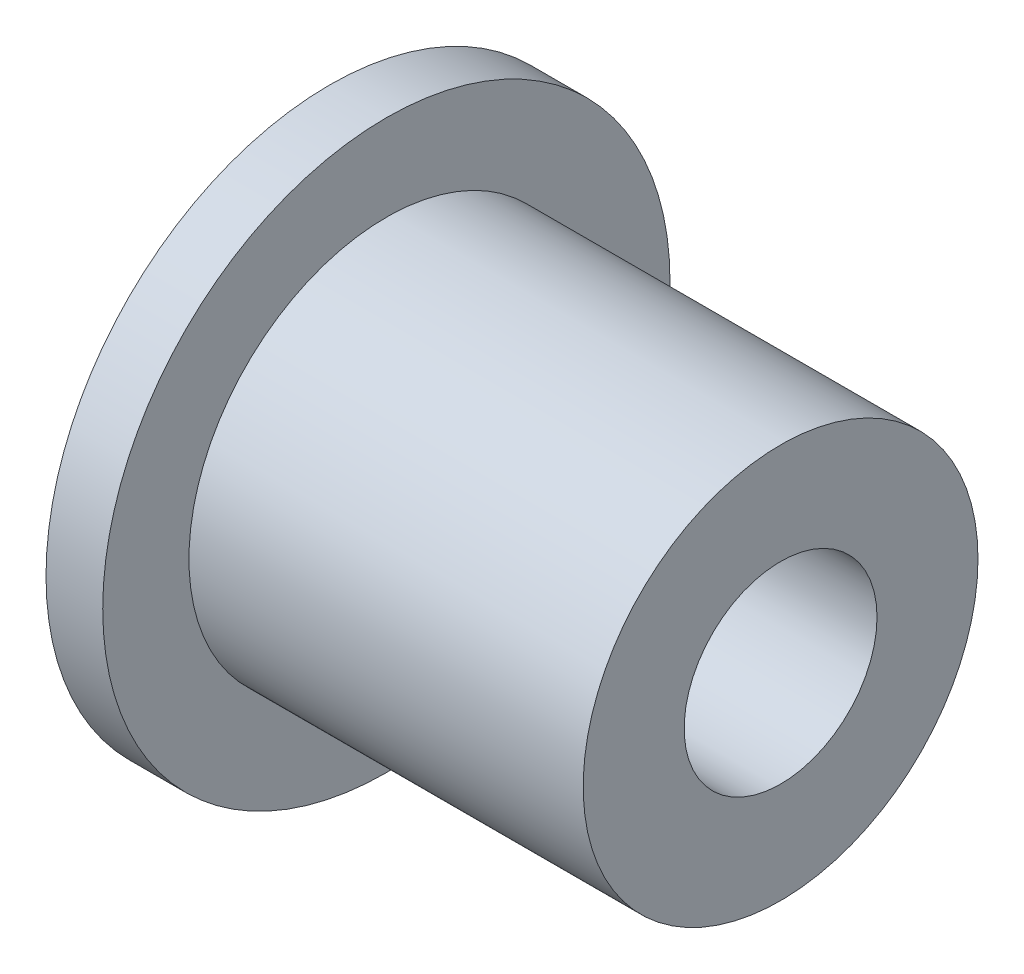
ISO-10303-21;
HEADER;
FILE_DESCRIPTION(('STEP AP214'),'2;1');
FILE_NAME('part.step','',(''),(''),'','','');
FILE_SCHEMA(('AUTOMOTIVE_DESIGN { 1 0 10303 214 1 1 1 1 }'));
ENDSEC;
DATA;
#1=APPLICATION_CONTEXT('core data for automotive mechanical design processes');
#2=APPLICATION_PROTOCOL_DEFINITION('international standard','automotive_design',2000,#1);
#3=PRODUCT_CONTEXT('',#1,'mechanical');
#4=PRODUCT('Part','Part','',(#3));
#5=PRODUCT_RELATED_PRODUCT_CATEGORY('part','',(#4));
#6=PRODUCT_DEFINITION_FORMATION('','',#4);
#7=PRODUCT_DEFINITION_CONTEXT('part definition',#1,'design');
#8=PRODUCT_DEFINITION('design','',#6,#7);
#9=PRODUCT_DEFINITION_SHAPE('','',#8);
#10=(LENGTH_UNIT() NAMED_UNIT(*) SI_UNIT(.MILLI.,.METRE.));
#11=(NAMED_UNIT(*) PLANE_ANGLE_UNIT() SI_UNIT($,.RADIAN.));
#12=(NAMED_UNIT(*) SI_UNIT($,.STERADIAN.) SOLID_ANGLE_UNIT());
#13=UNCERTAINTY_MEASURE_WITH_UNIT(LENGTH_MEASURE(1.E-05),#10,'distance_accuracy_value','');
#14=(GEOMETRIC_REPRESENTATION_CONTEXT(3) GLOBAL_UNCERTAINTY_ASSIGNED_CONTEXT((#13)) GLOBAL_UNIT_ASSIGNED_CONTEXT((#10,
#11,#12)) REPRESENTATION_CONTEXT('',''));
#15=CARTESIAN_POINT('',(0.,0.,0.));
#16=DIRECTION('',(0.,0.,1.));
#17=DIRECTION('',(1.,0.,0.));
#18=AXIS2_PLACEMENT_3D('',#15,#16,#17);
#19=CARTESIAN_POINT('',(-41.65,80.6,0.));
#20=DIRECTION('',(1.,0.,0.));
#21=DIRECTION('',(0.,0.,1.));
#22=AXIS2_PLACEMENT_3D('',#19,#20,#21);
#23=PLANE('',#22);
#24=CARTESIAN_POINT('',(-41.65,80.6,0.));
#25=DIRECTION('',(1.,0.,0.));
#26=DIRECTION('',(0.,0.,-1.));
#27=AXIS2_PLACEMENT_3D('',#24,#25,#26);
#28=CIRCLE('',#27,1.7);
#29=CARTESIAN_POINT('',(-41.65,80.6,-1.7));
#30=VERTEX_POINT('',#29);
#31=EDGE_CURVE('E9',#30,#30,#28,.T.);
#32=ORIENTED_EDGE('',*,*,#31,.F.);
#33=EDGE_LOOP('',(#32));
#34=FACE_BOUND('',#33,.T.);
#35=CARTESIAN_POINT('',(-41.65,80.6,0.));
#36=DIRECTION('',(1.,0.,0.));
#37=DIRECTION('',(0.,0.,-1.));
#38=AXIS2_PLACEMENT_3D('',#35,#36,#37);
#39=CIRCLE('',#38,3.48);
#40=CARTESIAN_POINT('',(-41.65,80.6,-3.48));
#41=VERTEX_POINT('',#40);
#42=EDGE_CURVE('E74',#41,#41,#39,.T.);
#43=ORIENTED_EDGE('',*,*,#42,.T.);
#44=EDGE_LOOP('',(#43));
#45=FACE_BOUND('',#44,.T.);
#46=ADVANCED_FACE('F14',(#34,#45),#23,.T.);
#47=CARTESIAN_POINT('',(-49.7,80.6,0.));
#48=DIRECTION('',(1.,0.,0.));
#49=DIRECTION('',(0.,0.,-1.));
#50=AXIS2_PLACEMENT_3D('',#47,#48,#49);
#51=CYLINDRICAL_SURFACE('',#50,1.7);
#52=DIRECTION('',(1.,0.,0.));
#53=VECTOR('',#52,1.);
#54=CARTESIAN_POINT('',(-49.7,80.6,-1.7));
#55=LINE('',#54,#53);
#56=CARTESIAN_POINT('',(-49.6,80.6,-1.7));
#57=VERTEX_POINT('',#56);
#58=EDGE_CURVE('E25',#57,#30,#55,.T.);
#59=ORIENTED_EDGE('',*,*,#58,.F.);
#60=CARTESIAN_POINT('',(-49.6,80.6,0.));
#61=DIRECTION('',(1.,0.,0.));
#62=DIRECTION('',(0.,0.,-1.));
#63=AXIS2_PLACEMENT_3D('',#60,#61,#62);
#64=CIRCLE('',#63,1.7);
#65=EDGE_CURVE('E67',#57,#57,#64,.T.);
#66=ORIENTED_EDGE('',*,*,#65,.F.);
#67=ORIENTED_EDGE('',*,*,#58,.T.);
#68=ORIENTED_EDGE('',*,*,#31,.T.);
#69=EDGE_LOOP('',(#59,#66,#67,#68));
#70=FACE_BOUND('',#69,.T.);
#71=ADVANCED_FACE('F91',(#70),#51,.F.);
#72=CARTESIAN_POINT('',(-48.6,80.6,0.));
#73=DIRECTION('',(1.,0.,0.));
#74=DIRECTION('',(0.,0.,-1.));
#75=AXIS2_PLACEMENT_3D('',#72,#73,#74);
#76=CYLINDRICAL_SURFACE('',#75,3.48);
#77=ORIENTED_EDGE('',*,*,#42,.F.);
#78=DIRECTION('',(1.,0.,0.));
#79=VECTOR('',#78,1.);
#80=CARTESIAN_POINT('',(-48.6,80.6,-3.48));
#81=LINE('',#80,#79);
#82=CARTESIAN_POINT('',(-48.6,80.6,-3.48));
#83=VERTEX_POINT('',#82);
#84=EDGE_CURVE('E73',#83,#41,#81,.T.);
#85=ORIENTED_EDGE('',*,*,#84,.F.);
#86=CARTESIAN_POINT('',(-48.6,80.6,0.));
#87=DIRECTION('',(1.,0.,0.));
#88=DIRECTION('',(0.,0.,-1.));
#89=AXIS2_PLACEMENT_3D('',#86,#87,#88);
#90=CIRCLE('',#89,3.48);
#91=EDGE_CURVE('E61',#83,#83,#90,.T.);
#92=ORIENTED_EDGE('',*,*,#91,.T.);
#93=ORIENTED_EDGE('',*,*,#84,.T.);
#94=EDGE_LOOP('',(#77,#85,#92,#93));
#95=FACE_BOUND('',#94,.T.);
#96=ADVANCED_FACE('F16',(#95),#76,.T.);
#97=CARTESIAN_POINT('',(-49.6,80.6,0.));
#98=DIRECTION('',(1.,0.,0.));
#99=DIRECTION('',(0.,0.,1.));
#100=AXIS2_PLACEMENT_3D('',#97,#98,#99);
#101=PLANE('',#100);
#102=ORIENTED_EDGE('',*,*,#65,.T.);
#103=EDGE_LOOP('',(#102));
#104=FACE_BOUND('',#103,.T.);
#105=CARTESIAN_POINT('',(-49.6,80.6,0.));
#106=DIRECTION('',(1.,0.,0.));
#107=DIRECTION('',(0.,0.,-1.));
#108=AXIS2_PLACEMENT_3D('',#105,#106,#107);
#109=CIRCLE('',#108,5.);
#110=CARTESIAN_POINT('',(-49.6,80.6,-5.));
#111=VERTEX_POINT('',#110);
#112=EDGE_CURVE('E55',#111,#111,#109,.T.);
#113=ORIENTED_EDGE('',*,*,#112,.F.);
#114=EDGE_LOOP('',(#113));
#115=FACE_BOUND('',#114,.T.);
#116=ADVANCED_FACE('F89',(#104,#115),#101,.F.);
#117=CARTESIAN_POINT('',(-48.6,80.6,0.));
#118=DIRECTION('',(1.,0.,0.));
#119=DIRECTION('',(0.,0.,1.));
#120=AXIS2_PLACEMENT_3D('',#117,#118,#119);
#121=PLANE('',#120);
#122=ORIENTED_EDGE('',*,*,#91,.F.);
#123=EDGE_LOOP('',(#122));
#124=FACE_BOUND('',#123,.T.);
#125=CARTESIAN_POINT('',(-48.6,80.6,0.));
#126=DIRECTION('',(1.,0.,0.));
#127=DIRECTION('',(0.,0.,-1.));
#128=AXIS2_PLACEMENT_3D('',#125,#126,#127);
#129=CIRCLE('',#128,5.);
#130=CARTESIAN_POINT('',(-48.6,80.6,-5.));
#131=VERTEX_POINT('',#130);
#132=EDGE_CURVE('E70',#131,#131,#129,.T.);
#133=ORIENTED_EDGE('',*,*,#132,.T.);
#134=EDGE_LOOP('',(#133));
#135=FACE_BOUND('',#134,.T.);
#136=ADVANCED_FACE('F104',(#124,#135),#121,.T.);
#137=CARTESIAN_POINT('',(-49.6,80.6,0.));
#138=DIRECTION('',(1.,0.,0.));
#139=DIRECTION('',(0.,0.,-1.));
#140=AXIS2_PLACEMENT_3D('',#137,#138,#139);
#141=CYLINDRICAL_SURFACE('',#140,5.);
#142=ORIENTED_EDGE('',*,*,#132,.F.);
#143=DIRECTION('',(1.,0.,0.));
#144=VECTOR('',#143,1.);
#145=CARTESIAN_POINT('',(-49.6,80.6,-5.));
#146=LINE('',#145,#144);
#147=EDGE_CURVE('E18',#111,#131,#146,.T.);
#148=ORIENTED_EDGE('',*,*,#147,.F.);
#149=ORIENTED_EDGE('',*,*,#112,.T.);
#150=ORIENTED_EDGE('',*,*,#147,.T.);
#151=EDGE_LOOP('',(#142,#148,#149,#150));
#152=FACE_BOUND('',#151,.T.);
#153=ADVANCED_FACE('F57',(#152),#141,.T.);
#154=CLOSED_SHELL('',(#46,#71,#96,#116,#136,#153));
#155=MANIFOLD_SOLID_BREP('B1',#154);
#156=ADVANCED_BREP_SHAPE_REPRESENTATION('',(#18,#155),#14);
#157=SHAPE_DEFINITION_REPRESENTATION(#9,#156);
ENDSEC;
END-ISO-10303-21;
